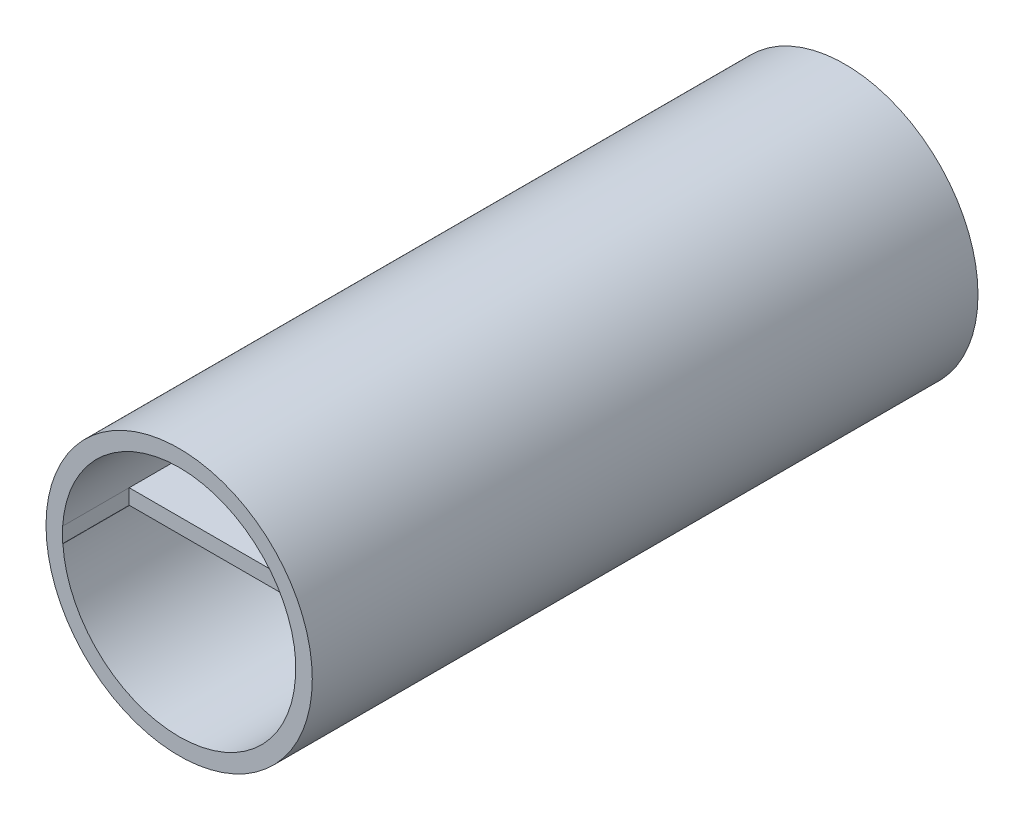
ISO-10303-21;
HEADER;
FILE_DESCRIPTION(('STEP AP214'),'2;1');
FILE_NAME('part.step','',(''),(''),'','','');
FILE_SCHEMA(('AUTOMOTIVE_DESIGN { 1 0 10303 214 1 1 1 1 }'));
ENDSEC;
DATA;
#1=APPLICATION_CONTEXT('core data for automotive mechanical design processes');
#2=APPLICATION_PROTOCOL_DEFINITION('international standard','automotive_design',2000,#1);
#3=PRODUCT_CONTEXT('',#1,'mechanical');
#4=PRODUCT('Part','Part','',(#3));
#5=PRODUCT_RELATED_PRODUCT_CATEGORY('part','',(#4));
#6=PRODUCT_DEFINITION_FORMATION('','',#4);
#7=PRODUCT_DEFINITION_CONTEXT('part definition',#1,'design');
#8=PRODUCT_DEFINITION('design','',#6,#7);
#9=PRODUCT_DEFINITION_SHAPE('','',#8);
#10=(LENGTH_UNIT() NAMED_UNIT(*) SI_UNIT(.MILLI.,.METRE.));
#11=(NAMED_UNIT(*) PLANE_ANGLE_UNIT() SI_UNIT($,.RADIAN.));
#12=(NAMED_UNIT(*) SI_UNIT($,.STERADIAN.) SOLID_ANGLE_UNIT());
#13=UNCERTAINTY_MEASURE_WITH_UNIT(LENGTH_MEASURE(1.E-05),#10,'distance_accuracy_value','');
#14=(GEOMETRIC_REPRESENTATION_CONTEXT(3) GLOBAL_UNCERTAINTY_ASSIGNED_CONTEXT((#13)) GLOBAL_UNIT_ASSIGNED_CONTEXT((#10,
#11,#12)) REPRESENTATION_CONTEXT('',''));
#15=CARTESIAN_POINT('',(0.,0.,0.));
#16=DIRECTION('',(0.,0.,1.));
#17=DIRECTION('',(1.,0.,0.));
#18=AXIS2_PLACEMENT_3D('',#15,#16,#17);
#19=CARTESIAN_POINT('',(0.,0.,100.));
#20=DIRECTION('',(0.,0.,1.));
#21=DIRECTION('',(1.,0.,0.));
#22=AXIS2_PLACEMENT_3D('',#19,#20,#21);
#23=PLANE('',#22);
#24=DIRECTION('',(0.,1.,0.));
#25=VECTOR('',#24,1.);
#26=CARTESIAN_POINT('',(35.,-2.27817990096519,100.));
#27=LINE('',#26,#25);
#28=CARTESIAN_POINT('',(35.,-2.27817990096519,100.));
#29=VERTEX_POINT('',#28);
#30=CARTESIAN_POINT('',(35.,2.27817990096519,100.));
#31=VERTEX_POINT('',#30);
#32=EDGE_CURVE('E239',#29,#31,#27,.T.);
#33=ORIENTED_EDGE('',*,*,#32,.F.);
#34=DIRECTION('',(1.,0.,0.));
#35=VECTOR('',#34,1.);
#36=CARTESIAN_POINT('',(-35.,-2.27817990096519,100.));
#37=LINE('',#36,#35);
#38=CARTESIAN_POINT('',(34.9257769611334,-2.27817990096519,100.));
#39=VERTEX_POINT('',#38);
#40=EDGE_CURVE('E268',#39,#29,#37,.T.);
#41=ORIENTED_EDGE('',*,*,#40,.F.);
#42=CARTESIAN_POINT('',(0.,0.,100.));
#43=DIRECTION('',(0.,0.,1.));
#44=DIRECTION('',(1.,0.,0.));
#45=AXIS2_PLACEMENT_3D('',#42,#43,#44);
#46=CIRCLE('',#45,35.);
#47=CARTESIAN_POINT('',(-34.9257769611334,-2.27817990096519,100.));
#48=VERTEX_POINT('',#47);
#49=EDGE_CURVE('E280',#48,#39,#46,.T.);
#50=ORIENTED_EDGE('',*,*,#49,.F.);
#51=CARTESIAN_POINT('',(-35.,-2.27817990096519,100.));
#52=VERTEX_POINT('',#51);
#53=EDGE_CURVE('E249',#52,#48,#37,.T.);
#54=ORIENTED_EDGE('',*,*,#53,.F.);
#55=DIRECTION('',(0.,-1.,0.));
#56=VECTOR('',#55,1.);
#57=CARTESIAN_POINT('',(-35.,-2.27817990096519,100.));
#58=LINE('',#57,#56);
#59=CARTESIAN_POINT('',(-35.,2.27817990096519,100.));
#60=VERTEX_POINT('',#59);
#61=EDGE_CURVE('E264',#60,#52,#58,.T.);
#62=ORIENTED_EDGE('',*,*,#61,.F.);
#63=CARTESIAN_POINT('',(0.,0.,100.));
#64=DIRECTION('',(0.,0.,1.));
#65=DIRECTION('',(1.,0.,0.));
#66=AXIS2_PLACEMENT_3D('',#63,#64,#65);
#67=CIRCLE('',#66,35.0740659699038);
#68=EDGE_CURVE('E294',#31,#60,#67,.T.);
#69=ORIENTED_EDGE('',*,*,#68,.F.);
#70=EDGE_LOOP('',(#33,#41,#50,#54,#62,#69));
#71=FACE_BOUND('',#70,.T.);
#72=CARTESIAN_POINT('',(0.,0.,100.));
#73=DIRECTION('',(0.,0.,1.));
#74=DIRECTION('',(1.,0.,0.));
#75=AXIS2_PLACEMENT_3D('',#72,#73,#74);
#76=CIRCLE('',#75,40.);
#77=CARTESIAN_POINT('',(40.,0.,100.));
#78=VERTEX_POINT('',#77);
#79=EDGE_CURVE('E198',#78,#78,#76,.T.);
#80=ORIENTED_EDGE('',*,*,#79,.T.);
#81=EDGE_LOOP('',(#80));
#82=FACE_BOUND('',#81,.T.);
#83=ADVANCED_FACE('F44',(#71,#82),#23,.T.);
#84=CARTESIAN_POINT('',(0.,0.,-100.));
#85=DIRECTION('',(0.,0.,1.));
#86=DIRECTION('',(1.,0.,0.));
#87=AXIS2_PLACEMENT_3D('',#84,#85,#86);
#88=PLANE('',#87);
#89=CARTESIAN_POINT('',(0.,0.,-100.));
#90=DIRECTION('',(0.,0.,1.));
#91=DIRECTION('',(1.,0.,0.));
#92=AXIS2_PLACEMENT_3D('',#89,#90,#91);
#93=CIRCLE('',#92,40.);
#94=CARTESIAN_POINT('',(40.,0.,-100.));
#95=VERTEX_POINT('',#94);
#96=EDGE_CURVE('E194',#95,#95,#93,.T.);
#97=ORIENTED_EDGE('',*,*,#96,.F.);
#98=EDGE_LOOP('',(#97));
#99=FACE_BOUND('',#98,.T.);
#100=CARTESIAN_POINT('',(0.,0.,-100.));
#101=DIRECTION('',(0.,0.,1.));
#102=DIRECTION('',(1.,0.,0.));
#103=AXIS2_PLACEMENT_3D('',#100,#101,#102);
#104=CIRCLE('',#103,35.0740659699038);
#105=CARTESIAN_POINT('',(35.,2.27817990096519,-100.));
#106=VERTEX_POINT('',#105);
#107=CARTESIAN_POINT('',(-35.,2.27817990096519,-100.));
#108=VERTEX_POINT('',#107);
#109=EDGE_CURVE('E293',#106,#108,#104,.T.);
#110=ORIENTED_EDGE('',*,*,#109,.T.);
#111=DIRECTION('',(0.,1.,0.));
#112=VECTOR('',#111,1.);
#113=CARTESIAN_POINT('',(-35.,-2.27817990096519,-100.));
#114=LINE('',#113,#112);
#115=CARTESIAN_POINT('',(-35.,-2.27817990096519,-100.));
#116=VERTEX_POINT('',#115);
#117=EDGE_CURVE('E153',#116,#108,#114,.T.);
#118=ORIENTED_EDGE('',*,*,#117,.F.);
#119=DIRECTION('',(-1.,0.,0.));
#120=VECTOR('',#119,1.);
#121=CARTESIAN_POINT('',(35.,-2.27817990096519,-100.));
#122=LINE('',#121,#120);
#123=CARTESIAN_POINT('',(-34.9257769611334,-2.27817990096519,-100.));
#124=VERTEX_POINT('',#123);
#125=EDGE_CURVE('E311',#124,#116,#122,.T.);
#126=ORIENTED_EDGE('',*,*,#125,.F.);
#127=CARTESIAN_POINT('',(0.,0.,-100.));
#128=DIRECTION('',(0.,0.,1.));
#129=DIRECTION('',(1.,0.,0.));
#130=AXIS2_PLACEMENT_3D('',#127,#128,#129);
#131=CIRCLE('',#130,35.);
#132=CARTESIAN_POINT('',(34.9257769611334,-2.27817990096519,-100.));
#133=VERTEX_POINT('',#132);
#134=EDGE_CURVE('E285',#124,#133,#131,.T.);
#135=ORIENTED_EDGE('',*,*,#134,.T.);
#136=CARTESIAN_POINT('',(35.,-2.27817990096519,-100.));
#137=VERTEX_POINT('',#136);
#138=EDGE_CURVE('E172',#137,#133,#122,.T.);
#139=ORIENTED_EDGE('',*,*,#138,.F.);
#140=DIRECTION('',(0.,-1.,0.));
#141=VECTOR('',#140,1.);
#142=CARTESIAN_POINT('',(35.,-2.27817990096519,-100.));
#143=LINE('',#142,#141);
#144=EDGE_CURVE('E302',#106,#137,#143,.T.);
#145=ORIENTED_EDGE('',*,*,#144,.F.);
#146=EDGE_LOOP('',(#110,#118,#126,#135,#139,#145));
#147=FACE_BOUND('',#146,.T.);
#148=ADVANCED_FACE('F299',(#99,#147),#88,.F.);
#149=CARTESIAN_POINT('',(0.,0.,100.));
#150=DIRECTION('',(0.,0.,-1.));
#151=DIRECTION('',(-1.,0.,0.));
#152=AXIS2_PLACEMENT_3D('',#149,#150,#151);
#153=CYLINDRICAL_SURFACE('',#152,40.);
#154=ORIENTED_EDGE('',*,*,#79,.F.);
#155=EDGE_LOOP('',(#154));
#156=FACE_BOUND('',#155,.T.);
#157=ORIENTED_EDGE('',*,*,#96,.T.);
#158=EDGE_LOOP('',(#157));
#159=FACE_BOUND('',#158,.T.);
#160=ADVANCED_FACE('F46',(#156,#159),#153,.T.);
#161=CARTESIAN_POINT('',(0.,0.,100.));
#162=DIRECTION('',(0.,0.,-1.));
#163=DIRECTION('',(-1.,0.,0.));
#164=AXIS2_PLACEMENT_3D('',#161,#162,#163);
#165=CYLINDRICAL_SURFACE('',#164,35.0740659699038);
#166=ORIENTED_EDGE('',*,*,#109,.F.);
#167=DIRECTION('',(0.,0.,-1.));
#168=VECTOR('',#167,1.);
#169=CARTESIAN_POINT('',(35.,2.27817990096519,-80.));
#170=LINE('',#169,#168);
#171=CARTESIAN_POINT('',(35.,2.27817990096519,-80.));
#172=VERTEX_POINT('',#171);
#173=EDGE_CURVE('E159',#172,#106,#170,.T.);
#174=ORIENTED_EDGE('',*,*,#173,.F.);
#175=DIRECTION('',(0.,0.,-1.));
#176=VECTOR('',#175,1.);
#177=CARTESIAN_POINT('',(35.,2.27817990096519,100.));
#178=LINE('',#177,#176);
#179=CARTESIAN_POINT('',(35.,2.27817990096519,80.));
#180=VERTEX_POINT('',#179);
#181=EDGE_CURVE('E182',#180,#172,#178,.T.);
#182=ORIENTED_EDGE('',*,*,#181,.F.);
#183=EDGE_CURVE('E190',#31,#180,#178,.T.);
#184=ORIENTED_EDGE('',*,*,#183,.F.);
#185=ORIENTED_EDGE('',*,*,#68,.T.);
#186=DIRECTION('',(0.,0.,-1.));
#187=VECTOR('',#186,1.);
#188=CARTESIAN_POINT('',(-35.,2.27817990096519,100.));
#189=LINE('',#188,#187);
#190=CARTESIAN_POINT('',(-35.,2.27817990096519,80.));
#191=VERTEX_POINT('',#190);
#192=EDGE_CURVE('E188',#60,#191,#189,.T.);
#193=ORIENTED_EDGE('',*,*,#192,.T.);
#194=CARTESIAN_POINT('',(-35.,2.27817990096519,-80.));
#195=VERTEX_POINT('',#194);
#196=EDGE_CURVE('E179',#191,#195,#189,.T.);
#197=ORIENTED_EDGE('',*,*,#196,.T.);
#198=DIRECTION('',(0.,0.,-1.));
#199=VECTOR('',#198,1.);
#200=CARTESIAN_POINT('',(-35.,2.27817990096519,-80.));
#201=LINE('',#200,#199);
#202=EDGE_CURVE('E147',#195,#108,#201,.T.);
#203=ORIENTED_EDGE('',*,*,#202,.T.);
#204=EDGE_LOOP('',(#166,#174,#182,#184,#185,#193,#197,#203));
#205=FACE_BOUND('',#204,.T.);
#206=ADVANCED_FACE('F186',(#205),#165,.F.);
#207=CARTESIAN_POINT('',(-35.,2.27817990096519,100.));
#208=DIRECTION('',(0.,1.,0.));
#209=DIRECTION('',(0.,0.,1.));
#210=AXIS2_PLACEMENT_3D('',#207,#208,#209);
#211=PLANE('',#210);
#212=DIRECTION('',(1.,0.,0.));
#213=VECTOR('',#212,1.);
#214=CARTESIAN_POINT('',(35.,2.27817990096519,-80.));
#215=LINE('',#214,#213);
#216=EDGE_CURVE('E166',#195,#172,#215,.T.);
#217=ORIENTED_EDGE('',*,*,#216,.F.);
#218=ORIENTED_EDGE('',*,*,#196,.F.);
#219=DIRECTION('',(-1.,0.,0.));
#220=VECTOR('',#219,1.);
#221=CARTESIAN_POINT('',(-35.,2.27817990096519,80.));
#222=LINE('',#221,#220);
#223=EDGE_CURVE('E248',#180,#191,#222,.T.);
#224=ORIENTED_EDGE('',*,*,#223,.F.);
#225=ORIENTED_EDGE('',*,*,#181,.T.);
#226=EDGE_LOOP('',(#217,#218,#224,#225));
#227=FACE_BOUND('',#226,.T.);
#228=ADVANCED_FACE('F177',(#227),#211,.T.);
#229=CARTESIAN_POINT('',(0.,0.,100.));
#230=DIRECTION('',(0.,0.,-1.));
#231=DIRECTION('',(-1.,0.,0.));
#232=AXIS2_PLACEMENT_3D('',#229,#230,#231);
#233=CYLINDRICAL_SURFACE('',#232,35.);
#234=DIRECTION('',(0.,0.,-1.));
#235=VECTOR('',#234,1.);
#236=CARTESIAN_POINT('',(-34.9257769611334,-2.27817990096519,100.));
#237=LINE('',#236,#235);
#238=CARTESIAN_POINT('',(-34.9257769611334,-2.27817990096519,-80.));
#239=VERTEX_POINT('',#238);
#240=EDGE_CURVE('E11',#239,#124,#237,.T.);
#241=ORIENTED_EDGE('',*,*,#240,.F.);
#242=CARTESIAN_POINT('',(0.,0.,-80.));
#243=DIRECTION('',(0.,0.,1.));
#244=DIRECTION('',(1.,0.,0.));
#245=AXIS2_PLACEMENT_3D('',#242,#243,#244);
#246=CIRCLE('',#245,35.);
#247=CARTESIAN_POINT('',(-34.9260904353417,-2.27336906425966,-80.));
#248=VERTEX_POINT('',#247);
#249=EDGE_CURVE('E234',#248,#239,#246,.T.);
#250=ORIENTED_EDGE('',*,*,#249,.F.);
#251=DIRECTION('',(0.,0.,-1.));
#252=VECTOR('',#251,1.);
#253=CARTESIAN_POINT('',(-34.9260904353417,-2.27336906425966,100.));
#254=LINE('',#253,#252);
#255=CARTESIAN_POINT('',(-34.9260904353417,-2.27336906425966,80.));
#256=VERTEX_POINT('',#255);
#257=EDGE_CURVE('E284',#256,#248,#254,.T.);
#258=ORIENTED_EDGE('',*,*,#257,.F.);
#259=CARTESIAN_POINT('',(0.,0.,80.));
#260=DIRECTION('',(0.,0.,-1.));
#261=DIRECTION('',(-1.,0.,0.));
#262=AXIS2_PLACEMENT_3D('',#259,#260,#261);
#263=CIRCLE('',#262,35.);
#264=CARTESIAN_POINT('',(-34.9257769611334,-2.27817990096519,80.));
#265=VERTEX_POINT('',#264);
#266=EDGE_CURVE('E68',#265,#256,#263,.T.);
#267=ORIENTED_EDGE('',*,*,#266,.F.);
#268=DIRECTION('',(0.,0.,-1.));
#269=VECTOR('',#268,1.);
#270=CARTESIAN_POINT('',(-34.9257769611334,-2.27817990096519,100.));
#271=LINE('',#270,#269);
#272=EDGE_CURVE('E208',#48,#265,#271,.T.);
#273=ORIENTED_EDGE('',*,*,#272,.F.);
#274=ORIENTED_EDGE('',*,*,#49,.T.);
#275=DIRECTION('',(0.,0.,-1.));
#276=VECTOR('',#275,1.);
#277=CARTESIAN_POINT('',(34.9257769611334,-2.27817990096519,100.));
#278=LINE('',#277,#276);
#279=CARTESIAN_POINT('',(34.9257769611334,-2.27817990096519,80.));
#280=VERTEX_POINT('',#279);
#281=EDGE_CURVE('E211',#280,#39,#278,.F.);
#282=ORIENTED_EDGE('',*,*,#281,.F.);
#283=CARTESIAN_POINT('',(34.9260904353417,-2.27336906425966,80.));
#284=VERTEX_POINT('',#283);
#285=EDGE_CURVE('E279',#284,#280,#263,.T.);
#286=ORIENTED_EDGE('',*,*,#285,.F.);
#287=DIRECTION('',(0.,0.,-1.));
#288=VECTOR('',#287,1.);
#289=CARTESIAN_POINT('',(34.9260904353417,-2.27336906425966,100.));
#290=LINE('',#289,#288);
#291=CARTESIAN_POINT('',(34.9260904353417,-2.27336906425966,-80.));
#292=VERTEX_POINT('',#291);
#293=EDGE_CURVE('E232',#284,#292,#290,.T.);
#294=ORIENTED_EDGE('',*,*,#293,.T.);
#295=CARTESIAN_POINT('',(34.9257769611334,-2.27817990096519,-80.));
#296=VERTEX_POINT('',#295);
#297=EDGE_CURVE('E60',#296,#292,#246,.T.);
#298=ORIENTED_EDGE('',*,*,#297,.F.);
#299=DIRECTION('',(0.,0.,-1.));
#300=VECTOR('',#299,1.);
#301=CARTESIAN_POINT('',(34.9257769611334,-2.27817990096519,100.));
#302=LINE('',#301,#300);
#303=EDGE_CURVE('E53',#133,#296,#302,.F.);
#304=ORIENTED_EDGE('',*,*,#303,.F.);
#305=ORIENTED_EDGE('',*,*,#134,.F.);
#306=EDGE_LOOP('',(#241,#250,#258,#267,#273,#274,#282,#286,#294,#298,#304,#305));
#307=FACE_BOUND('',#306,.T.);
#308=ADVANCED_FACE('F229',(#307),#233,.F.);
#309=CARTESIAN_POINT('',(-34.9260904353417,-2.27336906425966,100.));
#310=DIRECTION('',(0.,-1.,0.));
#311=DIRECTION('',(0.,0.,-1.));
#312=AXIS2_PLACEMENT_3D('',#309,#310,#311);
#313=PLANE('',#312);
#314=DIRECTION('',(-1.,0.,0.));
#315=VECTOR('',#314,1.);
#316=CARTESIAN_POINT('',(-34.9260904353417,-2.27336906425966,-80.));
#317=LINE('',#316,#315);
#318=EDGE_CURVE('E214',#292,#248,#317,.T.);
#319=ORIENTED_EDGE('',*,*,#318,.F.);
#320=ORIENTED_EDGE('',*,*,#293,.F.);
#321=DIRECTION('',(1.,0.,0.));
#322=VECTOR('',#321,1.);
#323=CARTESIAN_POINT('',(-34.9260904353417,-2.27336906425966,80.));
#324=LINE('',#323,#322);
#325=EDGE_CURVE('E202',#256,#284,#324,.T.);
#326=ORIENTED_EDGE('',*,*,#325,.F.);
#327=ORIENTED_EDGE('',*,*,#257,.T.);
#328=EDGE_LOOP('',(#319,#320,#326,#327));
#329=FACE_BOUND('',#328,.T.);
#330=ADVANCED_FACE('F324',(#329),#313,.T.);
#331=CARTESIAN_POINT('',(-35.,-2.27817990096519,80.));
#332=DIRECTION('',(0.,-1.,0.));
#333=DIRECTION('',(0.,0.,-1.));
#334=AXIS2_PLACEMENT_3D('',#331,#332,#333);
#335=PLANE('',#334);
#336=ORIENTED_EDGE('',*,*,#272,.T.);
#337=DIRECTION('',(1.,0.,0.));
#338=VECTOR('',#337,1.);
#339=CARTESIAN_POINT('',(-35.,-2.27817990096519,80.));
#340=LINE('',#339,#338);
#341=CARTESIAN_POINT('',(-35.,-2.27817990096519,80.));
#342=VERTEX_POINT('',#341);
#343=EDGE_CURVE('E258',#342,#265,#340,.T.);
#344=ORIENTED_EDGE('',*,*,#343,.F.);
#345=DIRECTION('',(0.,0.,1.));
#346=VECTOR('',#345,1.);
#347=CARTESIAN_POINT('',(-35.,-2.27817990096519,80.));
#348=LINE('',#347,#346);
#349=EDGE_CURVE('E261',#342,#52,#348,.T.);
#350=ORIENTED_EDGE('',*,*,#349,.T.);
#351=ORIENTED_EDGE('',*,*,#53,.T.);
#352=EDGE_LOOP('',(#336,#344,#350,#351));
#353=FACE_BOUND('',#352,.T.);
#354=ADVANCED_FACE('F348',(#353),#335,.F.);
#355=CARTESIAN_POINT('',(35.,-2.27817990096519,80.));
#356=DIRECTION('',(1.,0.,0.));
#357=DIRECTION('',(0.,0.,-1.));
#358=AXIS2_PLACEMENT_3D('',#355,#356,#357);
#359=PLANE('',#358);
#360=ORIENTED_EDGE('',*,*,#32,.T.);
#361=ORIENTED_EDGE('',*,*,#183,.T.);
#362=DIRECTION('',(0.,1.,0.));
#363=VECTOR('',#362,1.);
#364=CARTESIAN_POINT('',(35.,-2.27817990096519,80.));
#365=LINE('',#364,#363);
#366=CARTESIAN_POINT('',(35.,-2.27817990096519,80.));
#367=VERTEX_POINT('',#366);
#368=EDGE_CURVE('E244',#367,#180,#365,.T.);
#369=ORIENTED_EDGE('',*,*,#368,.F.);
#370=DIRECTION('',(0.,0.,1.));
#371=VECTOR('',#370,1.);
#372=CARTESIAN_POINT('',(35.,-2.27817990096519,80.));
#373=LINE('',#372,#371);
#374=EDGE_CURVE('E271',#367,#29,#373,.T.);
#375=ORIENTED_EDGE('',*,*,#374,.T.);
#376=EDGE_LOOP('',(#360,#361,#369,#375));
#377=FACE_BOUND('',#376,.T.);
#378=ADVANCED_FACE('F340',(#377),#359,.F.);
#379=ORIENTED_EDGE('',*,*,#281,.T.);
#380=ORIENTED_EDGE('',*,*,#40,.T.);
#381=ORIENTED_EDGE('',*,*,#374,.F.);
#382=EDGE_CURVE('E257',#280,#367,#340,.T.);
#383=ORIENTED_EDGE('',*,*,#382,.F.);
#384=EDGE_LOOP('',(#379,#380,#381,#383));
#385=FACE_BOUND('',#384,.T.);
#386=ADVANCED_FACE('F334',(#385),#335,.F.);
#387=CARTESIAN_POINT('',(-35.,-2.27817990096519,80.));
#388=DIRECTION('',(-1.,0.,0.));
#389=DIRECTION('',(0.,0.,1.));
#390=AXIS2_PLACEMENT_3D('',#387,#388,#389);
#391=PLANE('',#390);
#392=ORIENTED_EDGE('',*,*,#61,.T.);
#393=ORIENTED_EDGE('',*,*,#349,.F.);
#394=DIRECTION('',(0.,-1.,0.));
#395=VECTOR('',#394,1.);
#396=CARTESIAN_POINT('',(-35.,-2.27817990096519,80.));
#397=LINE('',#396,#395);
#398=EDGE_CURVE('E253',#191,#342,#397,.T.);
#399=ORIENTED_EDGE('',*,*,#398,.F.);
#400=ORIENTED_EDGE('',*,*,#192,.F.);
#401=EDGE_LOOP('',(#392,#393,#399,#400));
#402=FACE_BOUND('',#401,.T.);
#403=ADVANCED_FACE('F350',(#402),#391,.F.);
#404=CARTESIAN_POINT('',(0.,0.,80.));
#405=DIRECTION('',(0.,0.,-1.));
#406=DIRECTION('',(-1.,0.,0.));
#407=AXIS2_PLACEMENT_3D('',#404,#405,#406);
#408=PLANE('',#407);
#409=ORIENTED_EDGE('',*,*,#285,.T.);
#410=ORIENTED_EDGE('',*,*,#382,.T.);
#411=ORIENTED_EDGE('',*,*,#368,.T.);
#412=ORIENTED_EDGE('',*,*,#223,.T.);
#413=ORIENTED_EDGE('',*,*,#398,.T.);
#414=ORIENTED_EDGE('',*,*,#343,.T.);
#415=ORIENTED_EDGE('',*,*,#266,.T.);
#416=ORIENTED_EDGE('',*,*,#325,.T.);
#417=EDGE_LOOP('',(#409,#410,#411,#412,#413,#414,#415,#416));
#418=FACE_BOUND('',#417,.T.);
#419=ADVANCED_FACE('F325',(#418),#408,.F.);
#420=CARTESIAN_POINT('',(35.,-2.27817990096519,-80.));
#421=DIRECTION('',(0.,-1.,0.));
#422=DIRECTION('',(0.,0.,-1.));
#423=AXIS2_PLACEMENT_3D('',#420,#421,#422);
#424=PLANE('',#423);
#425=ORIENTED_EDGE('',*,*,#240,.T.);
#426=ORIENTED_EDGE('',*,*,#125,.T.);
#427=DIRECTION('',(0.,0.,-1.));
#428=VECTOR('',#427,1.);
#429=CARTESIAN_POINT('',(-35.,-2.27817990096519,-80.));
#430=LINE('',#429,#428);
#431=CARTESIAN_POINT('',(-35.,-2.27817990096519,-80.));
#432=VERTEX_POINT('',#431);
#433=EDGE_CURVE('E235',#432,#116,#430,.T.);
#434=ORIENTED_EDGE('',*,*,#433,.F.);
#435=DIRECTION('',(-1.,0.,0.));
#436=VECTOR('',#435,1.);
#437=CARTESIAN_POINT('',(35.,-2.27817990096519,-80.));
#438=LINE('',#437,#436);
#439=EDGE_CURVE('E169',#239,#432,#438,.T.);
#440=ORIENTED_EDGE('',*,*,#439,.F.);
#441=EDGE_LOOP('',(#425,#426,#434,#440));
#442=FACE_BOUND('',#441,.T.);
#443=ADVANCED_FACE('F320',(#442),#424,.F.);
#444=CARTESIAN_POINT('',(-35.,-2.27817990096519,-80.));
#445=DIRECTION('',(-1.,0.,0.));
#446=DIRECTION('',(0.,0.,1.));
#447=AXIS2_PLACEMENT_3D('',#444,#445,#446);
#448=PLANE('',#447);
#449=ORIENTED_EDGE('',*,*,#117,.T.);
#450=ORIENTED_EDGE('',*,*,#202,.F.);
#451=DIRECTION('',(0.,1.,0.));
#452=VECTOR('',#451,1.);
#453=CARTESIAN_POINT('',(-35.,-2.27817990096519,-80.));
#454=LINE('',#453,#452);
#455=EDGE_CURVE('E151',#432,#195,#454,.T.);
#456=ORIENTED_EDGE('',*,*,#455,.F.);
#457=ORIENTED_EDGE('',*,*,#433,.T.);
#458=EDGE_LOOP('',(#449,#450,#456,#457));
#459=FACE_BOUND('',#458,.T.);
#460=ADVANCED_FACE('F149',(#459),#448,.F.);
#461=ORIENTED_EDGE('',*,*,#303,.T.);
#462=CARTESIAN_POINT('',(35.,-2.27817990096519,-80.));
#463=VERTEX_POINT('',#462);
#464=EDGE_CURVE('E160',#463,#296,#438,.T.);
#465=ORIENTED_EDGE('',*,*,#464,.F.);
#466=DIRECTION('',(0.,0.,-1.));
#467=VECTOR('',#466,1.);
#468=CARTESIAN_POINT('',(35.,-2.27817990096519,-80.));
#469=LINE('',#468,#467);
#470=EDGE_CURVE('E240',#463,#137,#469,.T.);
#471=ORIENTED_EDGE('',*,*,#470,.T.);
#472=ORIENTED_EDGE('',*,*,#138,.T.);
#473=EDGE_LOOP('',(#461,#465,#471,#472));
#474=FACE_BOUND('',#473,.T.);
#475=ADVANCED_FACE('F220',(#474),#424,.F.);
#476=CARTESIAN_POINT('',(35.,-2.27817990096519,-80.));
#477=DIRECTION('',(1.,0.,0.));
#478=DIRECTION('',(0.,0.,-1.));
#479=AXIS2_PLACEMENT_3D('',#476,#477,#478);
#480=PLANE('',#479);
#481=ORIENTED_EDGE('',*,*,#144,.T.);
#482=ORIENTED_EDGE('',*,*,#470,.F.);
#483=DIRECTION('',(0.,-1.,0.));
#484=VECTOR('',#483,1.);
#485=CARTESIAN_POINT('',(35.,-2.27817990096519,-80.));
#486=LINE('',#485,#484);
#487=EDGE_CURVE('E184',#172,#463,#486,.T.);
#488=ORIENTED_EDGE('',*,*,#487,.F.);
#489=ORIENTED_EDGE('',*,*,#173,.T.);
#490=EDGE_LOOP('',(#481,#482,#488,#489));
#491=FACE_BOUND('',#490,.T.);
#492=ADVANCED_FACE('F384',(#491),#480,.F.);
#493=CARTESIAN_POINT('',(0.,0.,-80.));
#494=DIRECTION('',(0.,0.,1.));
#495=DIRECTION('',(1.,0.,0.));
#496=AXIS2_PLACEMENT_3D('',#493,#494,#495);
#497=PLANE('',#496);
#498=ORIENTED_EDGE('',*,*,#249,.T.);
#499=ORIENTED_EDGE('',*,*,#439,.T.);
#500=ORIENTED_EDGE('',*,*,#455,.T.);
#501=ORIENTED_EDGE('',*,*,#216,.T.);
#502=ORIENTED_EDGE('',*,*,#487,.T.);
#503=ORIENTED_EDGE('',*,*,#464,.T.);
#504=ORIENTED_EDGE('',*,*,#297,.T.);
#505=ORIENTED_EDGE('',*,*,#318,.T.);
#506=EDGE_LOOP('',(#498,#499,#500,#501,#502,#503,#504,#505));
#507=FACE_BOUND('',#506,.T.);
#508=ADVANCED_FACE('F164',(#507),#497,.F.);
#509=CLOSED_SHELL('',(#83,#148,#160,#206,#228,#308,#330,#354,#378,#386,#403,#419,#443,#460,#475,
#492,#508));
#510=MANIFOLD_SOLID_BREP('B2',#509);
#511=ADVANCED_BREP_SHAPE_REPRESENTATION('',(#18,#510),#14);
#512=SHAPE_DEFINITION_REPRESENTATION(#9,#511);
ENDSEC;
END-ISO-10303-21;
